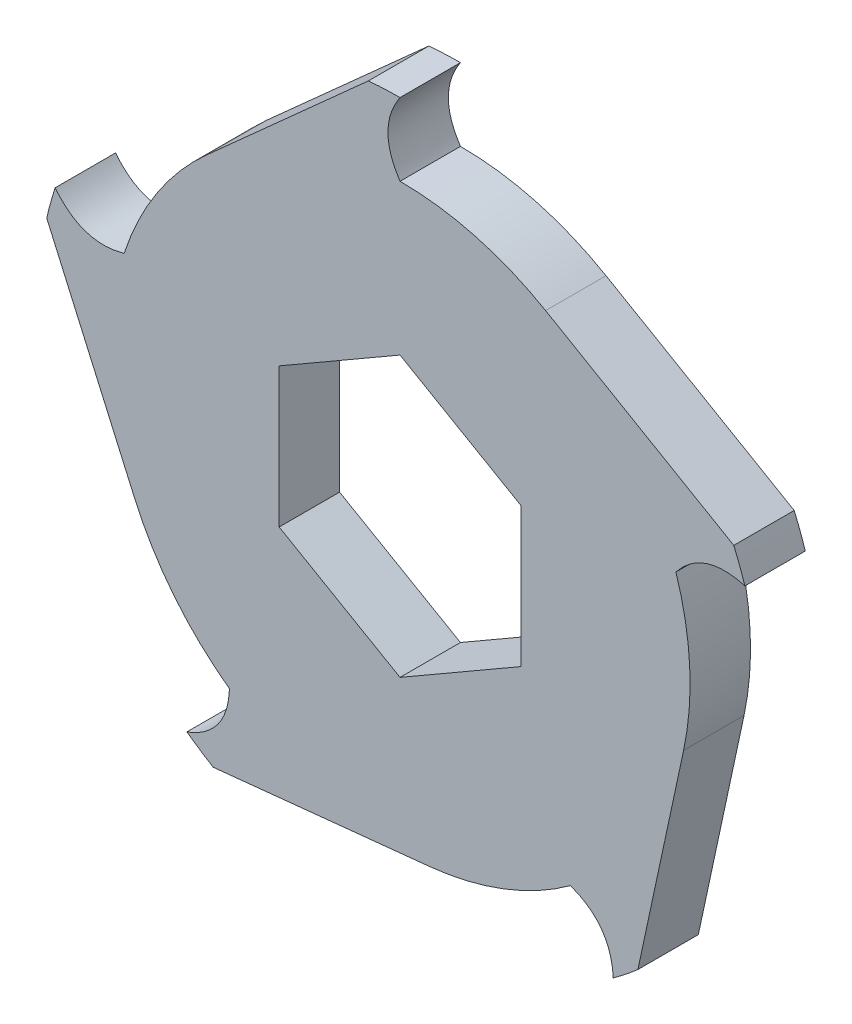
ISO-10303-21;
HEADER;
FILE_DESCRIPTION(('STEP AP214'),'2;1');
FILE_NAME('part.step','',(''),(''),'','','');
FILE_SCHEMA(('AUTOMOTIVE_DESIGN { 1 0 10303 214 1 1 1 1 }'));
ENDSEC;
DATA;
#1=APPLICATION_CONTEXT('core data for automotive mechanical design processes');
#2=APPLICATION_PROTOCOL_DEFINITION('international standard','automotive_design',2000,#1);
#3=PRODUCT_CONTEXT('',#1,'mechanical');
#4=PRODUCT('Part','Part','',(#3));
#5=PRODUCT_RELATED_PRODUCT_CATEGORY('part','',(#4));
#6=PRODUCT_DEFINITION_FORMATION('','',#4);
#7=PRODUCT_DEFINITION_CONTEXT('part definition',#1,'design');
#8=PRODUCT_DEFINITION('design','',#6,#7);
#9=PRODUCT_DEFINITION_SHAPE('','',#8);
#10=(LENGTH_UNIT() NAMED_UNIT(*) SI_UNIT(.MILLI.,.METRE.));
#11=(NAMED_UNIT(*) PLANE_ANGLE_UNIT() SI_UNIT($,.RADIAN.));
#12=(NAMED_UNIT(*) SI_UNIT($,.STERADIAN.) SOLID_ANGLE_UNIT());
#13=UNCERTAINTY_MEASURE_WITH_UNIT(LENGTH_MEASURE(1.E-05),#10,'distance_accuracy_value','');
#14=(GEOMETRIC_REPRESENTATION_CONTEXT(3) GLOBAL_UNCERTAINTY_ASSIGNED_CONTEXT((#13)) GLOBAL_UNIT_ASSIGNED_CONTEXT((#10,
#11,#12)) REPRESENTATION_CONTEXT('',''));
#15=CARTESIAN_POINT('',(0.,0.,0.));
#16=DIRECTION('',(0.,0.,1.));
#17=DIRECTION('',(1.,0.,0.));
#18=AXIS2_PLACEMENT_3D('',#15,#16,#17);
#19=CARTESIAN_POINT('',(0.,0.,6.35));
#20=DIRECTION('',(0.,0.,-1.));
#21=DIRECTION('',(-1.,0.,0.));
#22=AXIS2_PLACEMENT_3D('',#19,#20,#21);
#23=CYLINDRICAL_SURFACE('',#22,30.48);
#24=DIRECTION('',(0.,0.,-1.));
#25=VECTOR('',#24,1.);
#26=CARTESIAN_POINT('',(-28.9882026166763,9.41883798854832,6.35));
#27=LINE('',#26,#25);
#28=CARTESIAN_POINT('',(-28.9882026166763,9.41883798854831,6.35));
#29=VERTEX_POINT('',#28);
#30=CARTESIAN_POINT('',(-28.9882026166763,9.41883798854831,0.));
#31=VERTEX_POINT('',#30);
#32=EDGE_CURVE('E244',#29,#31,#27,.T.);
#33=ORIENTED_EDGE('',*,*,#32,.F.);
#34=CARTESIAN_POINT('',(0.,0.,6.35));
#35=DIRECTION('',(0.,0.,1.));
#36=DIRECTION('',(1.,0.,0.));
#37=AXIS2_PLACEMENT_3D('',#34,#35,#36);
#38=CIRCLE('',#37,30.48);
#39=CARTESIAN_POINT('',(-20.3436142698606,22.6973072949001,6.35));
#40=VERTEX_POINT('',#39);
#41=EDGE_CURVE('E230',#40,#29,#38,.T.);
#42=ORIENTED_EDGE('',*,*,#41,.F.);
#43=DIRECTION('',(0.,0.,-1.));
#44=VECTOR('',#43,1.);
#45=CARTESIAN_POINT('',(-20.3436142698606,22.6973072949001,6.35));
#46=LINE('',#45,#44);
#47=CARTESIAN_POINT('',(-20.3436142698606,22.6973072949001,0.));
#48=VERTEX_POINT('',#47);
#49=EDGE_CURVE('E419',#40,#48,#46,.T.);
#50=ORIENTED_EDGE('',*,*,#49,.T.);
#51=CARTESIAN_POINT('',(0.,0.,0.));
#52=DIRECTION('',(0.,0.,1.));
#53=DIRECTION('',(1.,0.,0.));
#54=AXIS2_PLACEMENT_3D('',#51,#52,#53);
#55=CIRCLE('',#54,30.48);
#56=EDGE_CURVE('E495',#48,#31,#55,.T.);
#57=ORIENTED_EDGE('',*,*,#56,.T.);
#58=EDGE_LOOP('',(#33,#42,#50,#57));
#59=FACE_BOUND('',#58,.T.);
#60=ADVANCED_FACE('F47',(#59),#23,.T.);
#61=CARTESIAN_POINT('',(-27.8729445415639,-12.3340732356715,6.35));
#62=VERTEX_POINT('',#61);
#63=CARTESIAN_POINT('',(-17.9156944898744,-24.6588379885485,6.35));
#64=VERTEX_POINT('',#63);
#65=EDGE_CURVE('E494',#62,#64,#38,.T.);
#66=ORIENTED_EDGE('',*,*,#65,.F.);
#67=DIRECTION('',(0.,0.,-1.));
#68=VECTOR('',#67,1.);
#69=CARTESIAN_POINT('',(-27.8729445415638,-12.3340732356715,6.35));
#70=LINE('',#69,#68);
#71=CARTESIAN_POINT('',(-27.8729445415638,-12.3340732356715,0.));
#72=VERTEX_POINT('',#71);
#73=EDGE_CURVE('E254',#62,#72,#70,.T.);
#74=ORIENTED_EDGE('',*,*,#73,.T.);
#75=CARTESIAN_POINT('',(-17.9156944898744,-24.6588379885485,0.));
#76=VERTEX_POINT('',#75);
#77=EDGE_CURVE('E498',#72,#76,#55,.T.);
#78=ORIENTED_EDGE('',*,*,#77,.T.);
#79=DIRECTION('',(0.,0.,-1.));
#80=VECTOR('',#79,1.);
#81=CARTESIAN_POINT('',(-17.9156944898744,-24.6588379885485,6.35));
#82=LINE('',#81,#80);
#83=EDGE_CURVE('E265',#64,#76,#82,.T.);
#84=ORIENTED_EDGE('',*,*,#83,.F.);
#85=EDGE_LOOP('',(#66,#74,#78,#84));
#86=FACE_BOUND('',#85,.T.);
#87=ADVANCED_FACE('F549',(#86),#23,.T.);
#88=CARTESIAN_POINT('',(3.11718717663342,-30.3201837742754,6.35));
#89=VERTEX_POINT('',#88);
#90=CARTESIAN_POINT('',(17.9156944898748,-24.6588379885482,6.35));
#91=VERTEX_POINT('',#90);
#92=EDGE_CURVE('E571',#89,#91,#38,.T.);
#93=ORIENTED_EDGE('',*,*,#92,.F.);
#94=DIRECTION('',(0.,0.,-1.));
#95=VECTOR('',#94,1.);
#96=CARTESIAN_POINT('',(3.11718717663344,-30.3201837742754,6.35));
#97=LINE('',#96,#95);
#98=CARTESIAN_POINT('',(3.11718717663344,-30.3201837742754,0.));
#99=VERTEX_POINT('',#98);
#100=EDGE_CURVE('E631',#89,#99,#97,.T.);
#101=ORIENTED_EDGE('',*,*,#100,.T.);
#102=CARTESIAN_POINT('',(17.9156944898748,-24.6588379885482,0.));
#103=VERTEX_POINT('',#102);
#104=EDGE_CURVE('E583',#99,#103,#55,.T.);
#105=ORIENTED_EDGE('',*,*,#104,.T.);
#106=DIRECTION('',(0.,0.,-1.));
#107=VECTOR('',#106,1.);
#108=CARTESIAN_POINT('',(17.9156944898748,-24.6588379885482,6.35));
#109=LINE('',#108,#107);
#110=EDGE_CURVE('E362',#91,#103,#109,.T.);
#111=ORIENTED_EDGE('',*,*,#110,.F.);
#112=EDGE_LOOP('',(#93,#101,#105,#111));
#113=FACE_BOUND('',#112,.T.);
#114=ADVANCED_FACE('F554',(#113),#23,.T.);
#115=CARTESIAN_POINT('',(29.7994721660186,-6.40483088197364,6.35));
#116=VERTEX_POINT('',#115);
#117=CARTESIAN_POINT('',(28.9882026166762,9.41883798854872,6.35));
#118=VERTEX_POINT('',#117);
#119=EDGE_CURVE('E567',#116,#118,#38,.T.);
#120=ORIENTED_EDGE('',*,*,#119,.F.);
#121=DIRECTION('',(0.,0.,-1.));
#122=VECTOR('',#121,1.);
#123=CARTESIAN_POINT('',(29.7994721660186,-6.40483088197361,6.35));
#124=LINE('',#123,#122);
#125=CARTESIAN_POINT('',(29.7994721660186,-6.40483088197361,0.));
#126=VERTEX_POINT('',#125);
#127=EDGE_CURVE('E336',#116,#126,#124,.T.);
#128=ORIENTED_EDGE('',*,*,#127,.T.);
#129=CARTESIAN_POINT('',(28.9882026166762,9.41883798854872,0.));
#130=VERTEX_POINT('',#129);
#131=EDGE_CURVE('E579',#126,#130,#55,.T.);
#132=ORIENTED_EDGE('',*,*,#131,.T.);
#133=DIRECTION('',(0.,0.,-1.));
#134=VECTOR('',#133,1.);
#135=CARTESIAN_POINT('',(28.9882026166762,9.41883798854872,6.35));
#136=LINE('',#135,#134);
#137=EDGE_CURVE('E71',#118,#130,#136,.T.);
#138=ORIENTED_EDGE('',*,*,#137,.F.);
#139=EDGE_LOOP('',(#120,#128,#132,#138));
#140=FACE_BOUND('',#139,.T.);
#141=ADVANCED_FACE('F557',(#140),#23,.T.);
#142=CARTESIAN_POINT('',(15.2998994687724,26.3617805970208,6.35));
#143=VERTEX_POINT('',#142);
#144=CARTESIAN_POINT('',(0.,30.48,6.35));
#145=VERTEX_POINT('',#144);
#146=EDGE_CURVE('E63',#143,#145,#38,.T.);
#147=ORIENTED_EDGE('',*,*,#146,.F.);
#148=DIRECTION('',(0.,0.,-1.));
#149=VECTOR('',#148,1.);
#150=CARTESIAN_POINT('',(15.2998994687723,26.3617805970208,6.35));
#151=LINE('',#150,#149);
#152=CARTESIAN_POINT('',(15.2998994687723,26.3617805970208,0.));
#153=VERTEX_POINT('',#152);
#154=EDGE_CURVE('E588',#143,#153,#151,.T.);
#155=ORIENTED_EDGE('',*,*,#154,.T.);
#156=CARTESIAN_POINT('',(0.,30.48,0.));
#157=VERTEX_POINT('',#156);
#158=EDGE_CURVE('E475',#153,#157,#55,.T.);
#159=ORIENTED_EDGE('',*,*,#158,.T.);
#160=DIRECTION('',(0.,0.,-1.));
#161=VECTOR('',#160,1.);
#162=CARTESIAN_POINT('',(0.,30.48,6.35));
#163=LINE('',#162,#161);
#164=EDGE_CURVE('E444',#145,#157,#163,.T.);
#165=ORIENTED_EDGE('',*,*,#164,.F.);
#166=EDGE_LOOP('',(#147,#155,#159,#165));
#167=FACE_BOUND('',#166,.T.);
#168=ADVANCED_FACE('F49',(#167),#23,.T.);
#169=CARTESIAN_POINT('',(0.,0.,6.35));
#170=DIRECTION('',(0.,0.,1.));
#171=DIRECTION('',(1.,0.,0.));
#172=AXIS2_PLACEMENT_3D('',#169,#170,#171);
#173=PLANE('',#172);
#174=DIRECTION('',(-0.866025403784439,0.5,0.));
#175=VECTOR('',#174,1.);
#176=CARTESIAN_POINT('',(12.7,7.33234841870825,6.35));
#177=LINE('',#176,#175);
#178=CARTESIAN_POINT('',(12.7,7.33234841870825,6.35));
#179=VERTEX_POINT('',#178);
#180=CARTESIAN_POINT('',(0.,14.6646968374165,6.35));
#181=VERTEX_POINT('',#180);
#182=EDGE_CURVE('E448',#179,#181,#177,.T.);
#183=ORIENTED_EDGE('',*,*,#182,.F.);
#184=DIRECTION('',(0.,1.,0.));
#185=VECTOR('',#184,1.);
#186=CARTESIAN_POINT('',(12.7,-7.33234841870825,6.35));
#187=LINE('',#186,#185);
#188=CARTESIAN_POINT('',(12.7,-7.33234841870825,6.35));
#189=VERTEX_POINT('',#188);
#190=EDGE_CURVE('E467',#189,#179,#187,.T.);
#191=ORIENTED_EDGE('',*,*,#190,.F.);
#192=DIRECTION('',(0.866025403784439,0.5,0.));
#193=VECTOR('',#192,1.);
#194=CARTESIAN_POINT('',(0.,-14.6646968374165,6.35));
#195=LINE('',#194,#193);
#196=CARTESIAN_POINT('',(0.,-14.6646968374165,6.35));
#197=VERTEX_POINT('',#196);
#198=EDGE_CURVE('E463',#197,#189,#195,.T.);
#199=ORIENTED_EDGE('',*,*,#198,.F.);
#200=DIRECTION('',(0.866025403784439,-0.5,0.));
#201=VECTOR('',#200,1.);
#202=CARTESIAN_POINT('',(-12.7,-7.33234841870825,6.35));
#203=LINE('',#202,#201);
#204=CARTESIAN_POINT('',(-12.7,-7.33234841870825,6.35));
#205=VERTEX_POINT('',#204);
#206=EDGE_CURVE('E459',#205,#197,#203,.T.);
#207=ORIENTED_EDGE('',*,*,#206,.F.);
#208=DIRECTION('',(0.,-1.,0.));
#209=VECTOR('',#208,1.);
#210=CARTESIAN_POINT('',(-12.7,7.33234841870825,6.35));
#211=LINE('',#210,#209);
#212=CARTESIAN_POINT('',(-12.7,7.33234841870825,6.35));
#213=VERTEX_POINT('',#212);
#214=EDGE_CURVE('E455',#213,#205,#211,.T.);
#215=ORIENTED_EDGE('',*,*,#214,.F.);
#216=DIRECTION('',(-0.866025403784439,-0.5,0.));
#217=VECTOR('',#216,1.);
#218=CARTESIAN_POINT('',(0.,14.6646968374165,6.35));
#219=LINE('',#218,#217);
#220=EDGE_CURVE('E451',#181,#213,#219,.T.);
#221=ORIENTED_EDGE('',*,*,#220,.F.);
#222=EDGE_LOOP('',(#183,#191,#199,#207,#215,#221));
#223=FACE_BOUND('',#222,.T.);
#224=ORIENTED_EDGE('',*,*,#41,.T.);
#225=CARTESIAN_POINT('',(-28.9882026166763,9.41883798854832,6.35));
#226=CARTESIAN_POINT('',(-33.3966311094732,8.18050918572716,6.35));
#227=CARTESIAN_POINT('',(-36.2352532708454,11.7735474856854,6.35));
#228=B_SPLINE_CURVE_WITH_KNOTS('',2,(#225,#226,#227),.UNSPECIFIED.,.F.,.F.,(3,3),(0.,1.),.UNSPECIFIED.);
#229=CARTESIAN_POINT('',(-36.2352532708454,11.7735474856854,6.35));
#230=VERTEX_POINT('',#229);
#231=EDGE_CURVE('E222',#29,#230,#228,.T.);
#232=ORIENTED_EDGE('',*,*,#231,.T.);
#233=CARTESIAN_POINT('',(0.,0.,6.35));
#234=DIRECTION('',(0.,0.,1.));
#235=DIRECTION('',(0.309016994374945,0.951056516295155,0.));
#236=AXIS2_PLACEMENT_3D('',#233,#234,#235);
#237=CIRCLE('',#236,38.1);
#238=CARTESIAN_POINT('',(-37.1234994683174,8.5706351705014,6.35));
#239=VERTEX_POINT('',#238);
#240=EDGE_CURVE('E227',#230,#239,#237,.T.);
#241=ORIENTED_EDGE('',*,*,#240,.T.);
#242=DIRECTION('',(0.404661195396045,-0.914466684434509,0.));
#243=VECTOR('',#242,1.);
#244=CARTESIAN_POINT('',(-27.8729445415639,-12.3340732356715,6.35));
#245=LINE('',#244,#243);
#246=EDGE_CURVE('E251',#239,#62,#245,.T.);
#247=ORIENTED_EDGE('',*,*,#246,.T.);
#248=ORIENTED_EDGE('',*,*,#65,.T.);
#249=CARTESIAN_POINT('',(-17.9156944898744,-24.6588379885485,6.35));
#250=CARTESIAN_POINT('',(-18.1002531353964,-29.2341672779399,6.35));
#251=CARTESIAN_POINT('',(-22.394618112343,-30.8235474856856,6.35));
#252=B_SPLINE_CURVE_WITH_KNOTS('',2,(#249,#250,#251),.UNSPECIFIED.,.F.,.F.,(3,3),(0.,1.),.UNSPECIFIED.);
#253=CARTESIAN_POINT('',(-22.3946181123431,-30.8235474856856,6.35));
#254=VERTEX_POINT('',#253);
#255=EDGE_CURVE('E282',#64,#254,#252,.T.);
#256=ORIENTED_EDGE('',*,*,#255,.T.);
#257=CARTESIAN_POINT('',(0.,0.,6.35));
#258=DIRECTION('',(0.,0.,1.));
#259=DIRECTION('',(-0.809016994374951,0.587785252292469,0.));
#260=AXIS2_PLACEMENT_3D('',#257,#258,#259);
#261=CIRCLE('',#260,38.1);
#262=CARTESIAN_POINT('',(-19.6229506540731,-32.6580741567504,6.35));
#263=VERTEX_POINT('',#262);
#264=EDGE_CURVE('E288',#254,#263,#261,.T.);
#265=ORIENTED_EDGE('',*,*,#264,.T.);
#266=DIRECTION('',(0.994756685507723,0.102269920493222,0.));
#267=VECTOR('',#266,1.);
#268=CARTESIAN_POINT('',(3.11718717663342,-30.3201837742754,6.35));
#269=LINE('',#268,#267);
#270=EDGE_CURVE('E623',#263,#89,#269,.T.);
#271=ORIENTED_EDGE('',*,*,#270,.T.);
#272=ORIENTED_EDGE('',*,*,#92,.T.);
#273=CARTESIAN_POINT('',(17.9156944898748,-24.6588379885482,6.35));
#274=CARTESIAN_POINT('',(22.2100594668215,-26.2482181962939,6.35));
#275=CARTESIAN_POINT('',(22.3946181123435,-30.8235474856853,6.35));
#276=B_SPLINE_CURVE_WITH_KNOTS('',2,(#273,#274,#275),.UNSPECIFIED.,.F.,.F.,(3,3),(0.,1.),.UNSPECIFIED.);
#277=CARTESIAN_POINT('',(22.3946181123435,-30.8235474856853,6.35));
#278=VERTEX_POINT('',#277);
#279=EDGE_CURVE('E317',#91,#278,#276,.T.);
#280=ORIENTED_EDGE('',*,*,#279,.T.);
#281=CARTESIAN_POINT('',(0.,0.,6.35));
#282=DIRECTION('',(0.,0.,1.));
#283=DIRECTION('',(-0.809016994374942,-0.58778525229248,0.));
#284=AXIS2_PLACEMENT_3D('',#281,#282,#283);
#285=CIRCLE('',#284,38.1);
#286=CARTESIAN_POINT('',(24.9958490045384,-28.7544350064876,6.35));
#287=VERTEX_POINT('',#286);
#288=EDGE_CURVE('E324',#278,#287,#285,.T.);
#289=ORIENTED_EDGE('',*,*,#288,.T.);
#290=DIRECTION('',(0.210132246783912,0.977672971326069,0.));
#291=VECTOR('',#290,1.);
#292=CARTESIAN_POINT('',(29.7994721660186,-6.40483088197363,6.35));
#293=LINE('',#292,#291);
#294=EDGE_CURVE('E332',#287,#116,#293,.T.);
#295=ORIENTED_EDGE('',*,*,#294,.T.);
#296=ORIENTED_EDGE('',*,*,#119,.T.);
#297=CARTESIAN_POINT('',(28.9882026166762,9.41883798854873,6.35));
#298=CARTESIAN_POINT('',(31.8268247780483,13.011876288507,6.35));
#299=CARTESIAN_POINT('',(36.2352532708452,11.7735474856859,6.35));
#300=B_SPLINE_CURVE_WITH_KNOTS('',2,(#297,#298,#299),.UNSPECIFIED.,.F.,.F.,(3,3),(0.,1.),.UNSPECIFIED.);
#301=CARTESIAN_POINT('',(36.2352532708452,11.7735474856859,6.35));
#302=VERTEX_POINT('',#301);
#303=EDGE_CURVE('E367',#118,#302,#300,.T.);
#304=ORIENTED_EDGE('',*,*,#303,.T.);
#305=CARTESIAN_POINT('',(0.,0.,6.35));
#306=DIRECTION('',(0.,0.,1.));
#307=DIRECTION('',(0.309016994374958,-0.95105651629515,0.));
#308=AXIS2_PLACEMENT_3D('',#305,#306,#307);
#309=CIRCLE('',#308,38.1);
#310=CARTESIAN_POINT('',(35.0712349165379,14.8868559954415,6.35));
#311=VERTEX_POINT('',#310);
#312=EDGE_CURVE('E373',#302,#311,#309,.T.);
#313=ORIENTED_EDGE('',*,*,#312,.T.);
#314=DIRECTION('',(-0.864887814862885,0.501965205668385,0.));
#315=VECTOR('',#314,1.);
#316=CARTESIAN_POINT('',(15.2998994687724,26.3617805970207,6.35));
#317=LINE('',#316,#315);
#318=EDGE_CURVE('E600',#311,#143,#317,.T.);
#319=ORIENTED_EDGE('',*,*,#318,.T.);
#320=ORIENTED_EDGE('',*,*,#146,.T.);
#321=CARTESIAN_POINT('',(0.,30.48,6.35));
#322=CARTESIAN_POINT('',(-2.54,34.29,6.35));
#323=CARTESIAN_POINT('',(0.,38.1,6.35));
#324=B_SPLINE_CURVE_WITH_KNOTS('',2,(#321,#322,#323),.UNSPECIFIED.,.F.,.F.,(3,3),(0.,1.),.UNSPECIFIED.);
#325=CARTESIAN_POINT('',(0.,38.1,6.35));
#326=VERTEX_POINT('',#325);
#327=EDGE_CURVE('E401',#145,#326,#324,.T.);
#328=ORIENTED_EDGE('',*,*,#327,.T.);
#329=CARTESIAN_POINT('',(0.,0.,6.35));
#330=DIRECTION('',(0.,0.,1.));
#331=DIRECTION('',(1.,0.,0.));
#332=AXIS2_PLACEMENT_3D('',#329,#330,#331);
#333=CIRCLE('',#332,38.1);
#334=CARTESIAN_POINT('',(-3.32063379868552,37.9550179972955,6.35));
#335=VERTEX_POINT('',#334);
#336=EDGE_CURVE('E408',#326,#335,#333,.T.);
#337=ORIENTED_EDGE('',*,*,#336,.T.);
#338=DIRECTION('',(-0.744662312824807,-0.667441413053168,0.));
#339=VECTOR('',#338,1.);
#340=CARTESIAN_POINT('',(-20.3436142698606,22.6973072949001,6.35));
#341=LINE('',#340,#339);
#342=EDGE_CURVE('E416',#335,#40,#341,.T.);
#343=ORIENTED_EDGE('',*,*,#342,.T.);
#344=EDGE_LOOP('',(#224,#232,#241,#247,#248,#256,#265,#271,#272,#280,#289,#295,#296,#304,#313,
#319,#320,#328,#337,#343));
#345=FACE_BOUND('',#344,.T.);
#346=ADVANCED_FACE('F224',(#223,#345),#173,.T.);
#347=CARTESIAN_POINT('',(0.,0.,0.));
#348=DIRECTION('',(0.,0.,1.));
#349=DIRECTION('',(1.,0.,0.));
#350=AXIS2_PLACEMENT_3D('',#347,#348,#349);
#351=PLANE('',#350);
#352=DIRECTION('',(0.,1.,0.));
#353=VECTOR('',#352,1.);
#354=CARTESIAN_POINT('',(12.7,0.,0.));
#355=LINE('',#354,#353);
#356=CARTESIAN_POINT('',(12.7,-7.33234841870825,0.));
#357=VERTEX_POINT('',#356);
#358=CARTESIAN_POINT('',(12.7,7.33234841870825,0.));
#359=VERTEX_POINT('',#358);
#360=EDGE_CURVE('E56',#357,#359,#355,.T.);
#361=ORIENTED_EDGE('',*,*,#360,.T.);
#362=DIRECTION('',(-0.866025403784439,0.5,0.));
#363=VECTOR('',#362,1.);
#364=CARTESIAN_POINT('',(6.35,10.9985226280624,0.));
#365=LINE('',#364,#363);
#366=CARTESIAN_POINT('',(0.,14.6646968374165,0.));
#367=VERTEX_POINT('',#366);
#368=EDGE_CURVE('E11',#359,#367,#365,.T.);
#369=ORIENTED_EDGE('',*,*,#368,.T.);
#370=DIRECTION('',(-0.866025403784439,-0.5,0.));
#371=VECTOR('',#370,1.);
#372=CARTESIAN_POINT('',(-6.35,10.9985226280624,0.));
#373=LINE('',#372,#371);
#374=CARTESIAN_POINT('',(-12.7,7.33234841870825,0.));
#375=VERTEX_POINT('',#374);
#376=EDGE_CURVE('E493',#367,#375,#373,.T.);
#377=ORIENTED_EDGE('',*,*,#376,.T.);
#378=DIRECTION('',(0.,-1.,0.));
#379=VECTOR('',#378,1.);
#380=CARTESIAN_POINT('',(-12.7,0.,0.));
#381=LINE('',#380,#379);
#382=CARTESIAN_POINT('',(-12.7,-7.33234841870825,0.));
#383=VERTEX_POINT('',#382);
#384=EDGE_CURVE('E502',#375,#383,#381,.T.);
#385=ORIENTED_EDGE('',*,*,#384,.T.);
#386=DIRECTION('',(0.866025403784439,-0.5,0.));
#387=VECTOR('',#386,1.);
#388=CARTESIAN_POINT('',(-6.35,-10.9985226280624,0.));
#389=LINE('',#388,#387);
#390=CARTESIAN_POINT('',(0.,-14.6646968374165,0.));
#391=VERTEX_POINT('',#390);
#392=EDGE_CURVE('E506',#383,#391,#389,.T.);
#393=ORIENTED_EDGE('',*,*,#392,.T.);
#394=DIRECTION('',(0.866025403784439,0.5,0.));
#395=VECTOR('',#394,1.);
#396=CARTESIAN_POINT('',(6.35,-10.9985226280624,0.));
#397=LINE('',#396,#395);
#398=EDGE_CURVE('E510',#391,#357,#397,.T.);
#399=ORIENTED_EDGE('',*,*,#398,.T.);
#400=EDGE_LOOP('',(#361,#369,#377,#385,#393,#399));
#401=FACE_BOUND('',#400,.T.);
#402=ORIENTED_EDGE('',*,*,#56,.F.);
#403=DIRECTION('',(-0.744662312824807,-0.667441413053168,0.));
#404=VECTOR('',#403,1.);
#405=CARTESIAN_POINT('',(-20.3436142698606,22.6973072949001,0.));
#406=LINE('',#405,#404);
#407=CARTESIAN_POINT('',(-3.32063379868552,37.9550179972955,0.));
#408=VERTEX_POINT('',#407);
#409=EDGE_CURVE('E409',#408,#48,#406,.T.);
#410=ORIENTED_EDGE('',*,*,#409,.F.);
#411=CARTESIAN_POINT('',(0.,0.,0.));
#412=DIRECTION('',(0.,0.,1.));
#413=DIRECTION('',(1.,0.,0.));
#414=AXIS2_PLACEMENT_3D('',#411,#412,#413);
#415=CIRCLE('',#414,38.1);
#416=CARTESIAN_POINT('',(0.,38.1,0.));
#417=VERTEX_POINT('',#416);
#418=EDGE_CURVE('E424',#417,#408,#415,.T.);
#419=ORIENTED_EDGE('',*,*,#418,.F.);
#420=CARTESIAN_POINT('',(0.,30.48,0.));
#421=CARTESIAN_POINT('',(-2.54,34.29,0.));
#422=CARTESIAN_POINT('',(0.,38.1,0.));
#423=B_SPLINE_CURVE_WITH_KNOTS('',2,(#420,#421,#422),.UNSPECIFIED.,.F.,.F.,(3,3),(0.,1.),.UNSPECIFIED.);
#424=EDGE_CURVE('E281',#157,#417,#423,.T.);
#425=ORIENTED_EDGE('',*,*,#424,.F.);
#426=ORIENTED_EDGE('',*,*,#158,.F.);
#427=DIRECTION('',(-0.864887814862885,0.501965205668385,0.));
#428=VECTOR('',#427,1.);
#429=CARTESIAN_POINT('',(15.2998994687724,26.3617805970207,0.));
#430=LINE('',#429,#428);
#431=CARTESIAN_POINT('',(35.0712349165379,14.8868559954415,0.));
#432=VERTEX_POINT('',#431);
#433=EDGE_CURVE('E374',#432,#153,#430,.T.);
#434=ORIENTED_EDGE('',*,*,#433,.F.);
#435=CARTESIAN_POINT('',(0.,0.,0.));
#436=DIRECTION('',(0.,0.,1.));
#437=DIRECTION('',(0.309016994374958,-0.95105651629515,0.));
#438=AXIS2_PLACEMENT_3D('',#435,#436,#437);
#439=CIRCLE('',#438,38.1);
#440=CARTESIAN_POINT('',(36.2352532708452,11.7735474856859,0.));
#441=VERTEX_POINT('',#440);
#442=EDGE_CURVE('E879',#441,#432,#439,.T.);
#443=ORIENTED_EDGE('',*,*,#442,.F.);
#444=CARTESIAN_POINT('',(28.9882026166762,9.41883798854873,0.));
#445=CARTESIAN_POINT('',(31.8268247780483,13.011876288507,0.));
#446=CARTESIAN_POINT('',(36.2352532708452,11.7735474856859,0.));
#447=B_SPLINE_CURVE_WITH_KNOTS('',2,(#444,#445,#446),.UNSPECIFIED.,.F.,.F.,(3,3),(0.,1.),.UNSPECIFIED.);
#448=EDGE_CURVE('E581',#130,#441,#447,.T.);
#449=ORIENTED_EDGE('',*,*,#448,.F.);
#450=ORIENTED_EDGE('',*,*,#131,.F.);
#451=DIRECTION('',(0.210132246783912,0.977672971326069,0.));
#452=VECTOR('',#451,1.);
#453=CARTESIAN_POINT('',(29.7994721660186,-6.40483088197363,0.));
#454=LINE('',#453,#452);
#455=CARTESIAN_POINT('',(24.9958490045384,-28.7544350064876,0.));
#456=VERTEX_POINT('',#455);
#457=EDGE_CURVE('E325',#456,#126,#454,.T.);
#458=ORIENTED_EDGE('',*,*,#457,.F.);
#459=CARTESIAN_POINT('',(0.,0.,0.));
#460=DIRECTION('',(0.,0.,1.));
#461=DIRECTION('',(-0.809016994374942,-0.58778525229248,0.));
#462=AXIS2_PLACEMENT_3D('',#459,#460,#461);
#463=CIRCLE('',#462,38.1);
#464=CARTESIAN_POINT('',(22.3946181123435,-30.8235474856853,0.));
#465=VERTEX_POINT('',#464);
#466=EDGE_CURVE('E342',#465,#456,#463,.T.);
#467=ORIENTED_EDGE('',*,*,#466,.F.);
#468=CARTESIAN_POINT('',(17.9156944898748,-24.6588379885482,0.));
#469=CARTESIAN_POINT('',(22.2100594668215,-26.2482181962939,0.));
#470=CARTESIAN_POINT('',(22.3946181123435,-30.8235474856853,0.));
#471=B_SPLINE_CURVE_WITH_KNOTS('',2,(#468,#469,#470),.UNSPECIFIED.,.F.,.F.,(3,3),(0.,1.),.UNSPECIFIED.);
#472=EDGE_CURVE('E337',#103,#465,#471,.T.);
#473=ORIENTED_EDGE('',*,*,#472,.F.);
#474=ORIENTED_EDGE('',*,*,#104,.F.);
#475=DIRECTION('',(0.994756685507723,0.102269920493222,0.));
#476=VECTOR('',#475,1.);
#477=CARTESIAN_POINT('',(3.11718717663342,-30.3201837742754,0.));
#478=LINE('',#477,#476);
#479=CARTESIAN_POINT('',(-19.6229506540731,-32.6580741567504,0.));
#480=VERTEX_POINT('',#479);
#481=EDGE_CURVE('E289',#480,#99,#478,.T.);
#482=ORIENTED_EDGE('',*,*,#481,.F.);
#483=CARTESIAN_POINT('',(0.,0.,0.));
#484=DIRECTION('',(0.,0.,1.));
#485=DIRECTION('',(-0.809016994374951,0.587785252292469,0.));
#486=AXIS2_PLACEMENT_3D('',#483,#484,#485);
#487=CIRCLE('',#486,38.1);
#488=CARTESIAN_POINT('',(-22.3946181123431,-30.8235474856856,0.));
#489=VERTEX_POINT('',#488);
#490=EDGE_CURVE('E616',#489,#480,#487,.T.);
#491=ORIENTED_EDGE('',*,*,#490,.F.);
#492=CARTESIAN_POINT('',(-17.9156944898744,-24.6588379885485,0.));
#493=CARTESIAN_POINT('',(-18.1002531353964,-29.2341672779399,0.));
#494=CARTESIAN_POINT('',(-22.394618112343,-30.8235474856856,0.));
#495=B_SPLINE_CURVE_WITH_KNOTS('',2,(#492,#493,#494),.UNSPECIFIED.,.F.,.F.,(3,3),(0.,1.),.UNSPECIFIED.);
#496=EDGE_CURVE('E366',#76,#489,#495,.T.);
#497=ORIENTED_EDGE('',*,*,#496,.F.);
#498=ORIENTED_EDGE('',*,*,#77,.F.);
#499=DIRECTION('',(0.404661195396045,-0.914466684434509,0.));
#500=VECTOR('',#499,1.);
#501=CARTESIAN_POINT('',(-27.8729445415639,-12.3340732356715,0.));
#502=LINE('',#501,#500);
#503=CARTESIAN_POINT('',(-37.1234994683174,8.5706351705014,0.));
#504=VERTEX_POINT('',#503);
#505=EDGE_CURVE('E234',#504,#72,#502,.T.);
#506=ORIENTED_EDGE('',*,*,#505,.F.);
#507=CARTESIAN_POINT('',(0.,0.,0.));
#508=DIRECTION('',(0.,0.,1.));
#509=DIRECTION('',(0.309016994374945,0.951056516295155,0.));
#510=AXIS2_PLACEMENT_3D('',#507,#508,#509);
#511=CIRCLE('',#510,38.1);
#512=CARTESIAN_POINT('',(-36.2352532708454,11.7735474856854,0.));
#513=VERTEX_POINT('',#512);
#514=EDGE_CURVE('E264',#513,#504,#511,.T.);
#515=ORIENTED_EDGE('',*,*,#514,.F.);
#516=CARTESIAN_POINT('',(-28.9882026166763,9.41883798854832,0.));
#517=CARTESIAN_POINT('',(-33.3966311094732,8.18050918572716,0.));
#518=CARTESIAN_POINT('',(-36.2352532708454,11.7735474856854,0.));
#519=B_SPLINE_CURVE_WITH_KNOTS('',2,(#516,#517,#518),.UNSPECIFIED.,.F.,.F.,(3,3),(0.,1.),.UNSPECIFIED.);
#520=EDGE_CURVE('E240',#31,#513,#519,.T.);
#521=ORIENTED_EDGE('',*,*,#520,.F.);
#522=EDGE_LOOP('',(#402,#410,#419,#425,#426,#434,#443,#449,#450,#458,#467,#473,#474,#482,#491,
#497,#498,#506,#515,#521));
#523=FACE_BOUND('',#522,.T.);
#524=ADVANCED_FACE('F516',(#401,#523),#351,.F.);
#525=CARTESIAN_POINT('',(12.7,7.33234841870825,-1.2E-05));
#526=DIRECTION('',(0.5,0.866025403784439,0.));
#527=DIRECTION('',(-0.866025403784439,0.5,0.));
#528=AXIS2_PLACEMENT_3D('',#525,#526,#527);
#529=PLANE('',#528);
#530=DIRECTION('',(0.,0.,1.));
#531=VECTOR('',#530,1.);
#532=CARTESIAN_POINT('',(12.7,7.33234841870825,-1.2E-05));
#533=LINE('',#532,#531);
#534=EDGE_CURVE('E472',#359,#179,#533,.T.);
#535=ORIENTED_EDGE('',*,*,#534,.T.);
#536=ORIENTED_EDGE('',*,*,#182,.T.);
#537=DIRECTION('',(0.,0.,1.));
#538=VECTOR('',#537,1.);
#539=CARTESIAN_POINT('',(0.,14.6646968374165,-1.2E-05));
#540=LINE('',#539,#538);
#541=EDGE_CURVE('E471',#367,#181,#540,.T.);
#542=ORIENTED_EDGE('',*,*,#541,.F.);
#543=ORIENTED_EDGE('',*,*,#368,.F.);
#544=EDGE_LOOP('',(#535,#536,#542,#543));
#545=FACE_BOUND('',#544,.T.);
#546=ADVANCED_FACE('F533',(#545),#529,.F.);
#547=CARTESIAN_POINT('',(12.7,-7.33234841870825,-1.2E-05));
#548=DIRECTION('',(1.,0.,0.));
#549=DIRECTION('',(0.,0.,-1.));
#550=AXIS2_PLACEMENT_3D('',#547,#548,#549);
#551=PLANE('',#550);
#552=DIRECTION('',(0.,0.,1.));
#553=VECTOR('',#552,1.);
#554=CARTESIAN_POINT('',(12.7,-7.33234841870825,-1.2E-05));
#555=LINE('',#554,#553);
#556=EDGE_CURVE('E476',#357,#189,#555,.T.);
#557=ORIENTED_EDGE('',*,*,#556,.T.);
#558=ORIENTED_EDGE('',*,*,#190,.T.);
#559=ORIENTED_EDGE('',*,*,#534,.F.);
#560=ORIENTED_EDGE('',*,*,#360,.F.);
#561=EDGE_LOOP('',(#557,#558,#559,#560));
#562=FACE_BOUND('',#561,.T.);
#563=ADVANCED_FACE('F399',(#562),#551,.F.);
#564=CARTESIAN_POINT('',(0.,-14.6646968374165,-1.2E-05));
#565=DIRECTION('',(0.5,-0.866025403784439,0.));
#566=DIRECTION('',(0.866025403784439,0.5,0.));
#567=AXIS2_PLACEMENT_3D('',#564,#565,#566);
#568=PLANE('',#567);
#569=DIRECTION('',(0.,0.,1.));
#570=VECTOR('',#569,1.);
#571=CARTESIAN_POINT('',(0.,-14.6646968374165,-1.2E-05));
#572=LINE('',#571,#570);
#573=EDGE_CURVE('E479',#391,#197,#572,.T.);
#574=ORIENTED_EDGE('',*,*,#573,.T.);
#575=ORIENTED_EDGE('',*,*,#198,.T.);
#576=ORIENTED_EDGE('',*,*,#556,.F.);
#577=ORIENTED_EDGE('',*,*,#398,.F.);
#578=EDGE_LOOP('',(#574,#575,#576,#577));
#579=FACE_BOUND('',#578,.T.);
#580=ADVANCED_FACE('F522',(#579),#568,.F.);
#581=CARTESIAN_POINT('',(-12.7,-7.33234841870825,-1.2E-05));
#582=DIRECTION('',(-0.5,-0.866025403784439,0.));
#583=DIRECTION('',(0.866025403784439,-0.5,0.));
#584=AXIS2_PLACEMENT_3D('',#581,#582,#583);
#585=PLANE('',#584);
#586=DIRECTION('',(0.,0.,1.));
#587=VECTOR('',#586,1.);
#588=CARTESIAN_POINT('',(-12.7,-7.33234841870825,-1.2E-05));
#589=LINE('',#588,#587);
#590=EDGE_CURVE('E482',#383,#205,#589,.T.);
#591=ORIENTED_EDGE('',*,*,#590,.T.);
#592=ORIENTED_EDGE('',*,*,#206,.T.);
#593=ORIENTED_EDGE('',*,*,#573,.F.);
#594=ORIENTED_EDGE('',*,*,#392,.F.);
#595=EDGE_LOOP('',(#591,#592,#593,#594));
#596=FACE_BOUND('',#595,.T.);
#597=ADVANCED_FACE('F540',(#596),#585,.F.);
#598=CARTESIAN_POINT('',(-12.7,7.33234841870825,-1.2E-05));
#599=DIRECTION('',(-1.,0.,0.));
#600=DIRECTION('',(0.,-1.,0.));
#601=AXIS2_PLACEMENT_3D('',#598,#599,#600);
#602=PLANE('',#601);
#603=DIRECTION('',(0.,0.,1.));
#604=VECTOR('',#603,1.);
#605=CARTESIAN_POINT('',(-12.7,7.33234841870825,-1.2E-05));
#606=LINE('',#605,#604);
#607=EDGE_CURVE('E485',#375,#213,#606,.T.);
#608=ORIENTED_EDGE('',*,*,#607,.T.);
#609=ORIENTED_EDGE('',*,*,#214,.T.);
#610=ORIENTED_EDGE('',*,*,#590,.F.);
#611=ORIENTED_EDGE('',*,*,#384,.F.);
#612=EDGE_LOOP('',(#608,#609,#610,#611));
#613=FACE_BOUND('',#612,.T.);
#614=ADVANCED_FACE('F538',(#613),#602,.F.);
#615=CARTESIAN_POINT('',(0.,14.6646968374165,-1.2E-05));
#616=DIRECTION('',(-0.5,0.866025403784439,0.));
#617=DIRECTION('',(-0.866025403784439,-0.5,0.));
#618=AXIS2_PLACEMENT_3D('',#615,#616,#617);
#619=PLANE('',#618);
#620=ORIENTED_EDGE('',*,*,#541,.T.);
#621=ORIENTED_EDGE('',*,*,#220,.T.);
#622=ORIENTED_EDGE('',*,*,#607,.F.);
#623=ORIENTED_EDGE('',*,*,#376,.F.);
#624=EDGE_LOOP('',(#620,#621,#622,#623));
#625=FACE_BOUND('',#624,.T.);
#626=ADVANCED_FACE('F397',(#625),#619,.F.);
#627=DIRECTION('',(0.,0.,-1.));
#628=VECTOR('',#627,1.);
#629=SURFACE_OF_LINEAR_EXTRUSION('',#324,#628);
#630=ORIENTED_EDGE('',*,*,#424,.T.);
#631=DIRECTION('',(0.,0.,-1.));
#632=VECTOR('',#631,1.);
#633=CARTESIAN_POINT('',(0.,38.1,6.35));
#634=LINE('',#633,#632);
#635=EDGE_CURVE('E440',#326,#417,#634,.T.);
#636=ORIENTED_EDGE('',*,*,#635,.F.);
#637=ORIENTED_EDGE('',*,*,#327,.F.);
#638=ORIENTED_EDGE('',*,*,#164,.T.);
#639=EDGE_LOOP('',(#630,#636,#637,#638));
#640=FACE_BOUND('',#639,.T.);
#641=ADVANCED_FACE('F392',(#640),#629,.F.);
#642=CARTESIAN_POINT('',(0.,0.,6.35));
#643=DIRECTION('',(0.,0.,-1.));
#644=DIRECTION('',(-1.,0.,0.));
#645=AXIS2_PLACEMENT_3D('',#642,#643,#644);
#646=CYLINDRICAL_SURFACE('',#645,38.1);
#647=ORIENTED_EDGE('',*,*,#418,.T.);
#648=DIRECTION('',(0.,0.,-1.));
#649=VECTOR('',#648,1.);
#650=CARTESIAN_POINT('',(-3.32063379868552,37.9550179972955,6.35));
#651=LINE('',#650,#649);
#652=EDGE_CURVE('E436',#335,#408,#651,.T.);
#653=ORIENTED_EDGE('',*,*,#652,.F.);
#654=ORIENTED_EDGE('',*,*,#336,.F.);
#655=ORIENTED_EDGE('',*,*,#635,.T.);
#656=EDGE_LOOP('',(#647,#653,#654,#655));
#657=FACE_BOUND('',#656,.T.);
#658=ADVANCED_FACE('F388',(#657),#646,.T.);
#659=CARTESIAN_POINT('',(-20.3436142698606,22.6973072949001,6.35));
#660=DIRECTION('',(0.667441413053168,-0.744662312824806,0.));
#661=DIRECTION('',(0.744662312824807,0.667441413053168,0.));
#662=AXIS2_PLACEMENT_3D('',#659,#660,#661);
#663=PLANE('',#662);
#664=ORIENTED_EDGE('',*,*,#409,.T.);
#665=ORIENTED_EDGE('',*,*,#49,.F.);
#666=ORIENTED_EDGE('',*,*,#342,.F.);
#667=ORIENTED_EDGE('',*,*,#652,.T.);
#668=EDGE_LOOP('',(#664,#665,#666,#667));
#669=FACE_BOUND('',#668,.T.);
#670=ADVANCED_FACE('F384',(#669),#663,.F.);
#671=DIRECTION('',(0.,0.,-1.));
#672=VECTOR('',#671,1.);
#673=SURFACE_OF_LINEAR_EXTRUSION('',#300,#672);
#674=ORIENTED_EDGE('',*,*,#448,.T.);
#675=DIRECTION('',(0.,0.,-1.));
#676=VECTOR('',#675,1.);
#677=CARTESIAN_POINT('',(36.2352532708452,11.7735474856859,6.35));
#678=LINE('',#677,#676);
#679=EDGE_CURVE('E884',#302,#441,#678,.T.);
#680=ORIENTED_EDGE('',*,*,#679,.F.);
#681=ORIENTED_EDGE('',*,*,#303,.F.);
#682=ORIENTED_EDGE('',*,*,#137,.T.);
#683=EDGE_LOOP('',(#674,#680,#681,#682));
#684=FACE_BOUND('',#683,.T.);
#685=ADVANCED_FACE('F380',(#684),#673,.F.);
#686=CARTESIAN_POINT('',(0.,0.,6.35));
#687=DIRECTION('',(0.,0.,-1.));
#688=DIRECTION('',(-1.,0.,0.));
#689=AXIS2_PLACEMENT_3D('',#686,#687,#688);
#690=CYLINDRICAL_SURFACE('',#689,38.1);
#691=ORIENTED_EDGE('',*,*,#442,.T.);
#692=DIRECTION('',(0.,0.,-1.));
#693=VECTOR('',#692,1.);
#694=CARTESIAN_POINT('',(35.0712349165379,14.8868559954415,6.35));
#695=LINE('',#694,#693);
#696=EDGE_CURVE('E882',#311,#432,#695,.T.);
#697=ORIENTED_EDGE('',*,*,#696,.F.);
#698=ORIENTED_EDGE('',*,*,#312,.F.);
#699=ORIENTED_EDGE('',*,*,#679,.T.);
#700=EDGE_LOOP('',(#691,#697,#698,#699));
#701=FACE_BOUND('',#700,.T.);
#702=ADVANCED_FACE('F383',(#701),#690,.T.);
#703=CARTESIAN_POINT('',(15.2998994687724,26.3617805970207,6.35));
#704=DIRECTION('',(-0.501965205668385,-0.864887814862885,0.));
#705=DIRECTION('',(0.864887814862885,-0.501965205668385,0.));
#706=AXIS2_PLACEMENT_3D('',#703,#704,#705);
#707=PLANE('',#706);
#708=ORIENTED_EDGE('',*,*,#433,.T.);
#709=ORIENTED_EDGE('',*,*,#154,.F.);
#710=ORIENTED_EDGE('',*,*,#318,.F.);
#711=ORIENTED_EDGE('',*,*,#696,.T.);
#712=EDGE_LOOP('',(#708,#709,#710,#711));
#713=FACE_BOUND('',#712,.T.);
#714=ADVANCED_FACE('F314',(#713),#707,.F.);
#715=DIRECTION('',(0.,0.,-1.));
#716=VECTOR('',#715,1.);
#717=SURFACE_OF_LINEAR_EXTRUSION('',#276,#716);
#718=ORIENTED_EDGE('',*,*,#472,.T.);
#719=DIRECTION('',(0.,0.,-1.));
#720=VECTOR('',#719,1.);
#721=CARTESIAN_POINT('',(22.3946181123435,-30.8235474856853,6.35));
#722=LINE('',#721,#720);
#723=EDGE_CURVE('E358',#278,#465,#722,.T.);
#724=ORIENTED_EDGE('',*,*,#723,.F.);
#725=ORIENTED_EDGE('',*,*,#279,.F.);
#726=ORIENTED_EDGE('',*,*,#110,.T.);
#727=EDGE_LOOP('',(#718,#724,#725,#726));
#728=FACE_BOUND('',#727,.T.);
#729=ADVANCED_FACE('F309',(#728),#717,.F.);
#730=CARTESIAN_POINT('',(0.,0.,6.35));
#731=DIRECTION('',(0.,0.,-1.));
#732=DIRECTION('',(-1.,0.,0.));
#733=AXIS2_PLACEMENT_3D('',#730,#731,#732);
#734=CYLINDRICAL_SURFACE('',#733,38.1);
#735=ORIENTED_EDGE('',*,*,#466,.T.);
#736=DIRECTION('',(0.,0.,-1.));
#737=VECTOR('',#736,1.);
#738=CARTESIAN_POINT('',(24.9958490045384,-28.7544350064876,6.35));
#739=LINE('',#738,#737);
#740=EDGE_CURVE('E354',#287,#456,#739,.T.);
#741=ORIENTED_EDGE('',*,*,#740,.F.);
#742=ORIENTED_EDGE('',*,*,#288,.F.);
#743=ORIENTED_EDGE('',*,*,#723,.T.);
#744=EDGE_LOOP('',(#735,#741,#742,#743));
#745=FACE_BOUND('',#744,.T.);
#746=ADVANCED_FACE('F305',(#745),#734,.T.);
#747=CARTESIAN_POINT('',(29.7994721660186,-6.40483088197363,6.35));
#748=DIRECTION('',(-0.977672971326069,0.210132246783912,0.));
#749=DIRECTION('',(-0.210132246783912,-0.977672971326069,0.));
#750=AXIS2_PLACEMENT_3D('',#747,#748,#749);
#751=PLANE('',#750);
#752=ORIENTED_EDGE('',*,*,#457,.T.);
#753=ORIENTED_EDGE('',*,*,#127,.F.);
#754=ORIENTED_EDGE('',*,*,#294,.F.);
#755=ORIENTED_EDGE('',*,*,#740,.T.);
#756=EDGE_LOOP('',(#752,#753,#754,#755));
#757=FACE_BOUND('',#756,.T.);
#758=ADVANCED_FACE('F300',(#757),#751,.F.);
#759=DIRECTION('',(0.,0.,-1.));
#760=VECTOR('',#759,1.);
#761=SURFACE_OF_LINEAR_EXTRUSION('',#252,#760);
#762=ORIENTED_EDGE('',*,*,#496,.T.);
#763=DIRECTION('',(0.,0.,-1.));
#764=VECTOR('',#763,1.);
#765=CARTESIAN_POINT('',(-22.3946181123431,-30.8235474856856,6.35));
#766=LINE('',#765,#764);
#767=EDGE_CURVE('E613',#254,#489,#766,.T.);
#768=ORIENTED_EDGE('',*,*,#767,.F.);
#769=ORIENTED_EDGE('',*,*,#255,.F.);
#770=ORIENTED_EDGE('',*,*,#83,.T.);
#771=EDGE_LOOP('',(#762,#768,#769,#770));
#772=FACE_BOUND('',#771,.T.);
#773=ADVANCED_FACE('F295',(#772),#761,.F.);
#774=CARTESIAN_POINT('',(0.,0.,6.35));
#775=DIRECTION('',(0.,0.,-1.));
#776=DIRECTION('',(-1.,0.,0.));
#777=AXIS2_PLACEMENT_3D('',#774,#775,#776);
#778=CYLINDRICAL_SURFACE('',#777,38.1);
#779=ORIENTED_EDGE('',*,*,#490,.T.);
#780=DIRECTION('',(0.,0.,-1.));
#781=VECTOR('',#780,1.);
#782=CARTESIAN_POINT('',(-19.6229506540731,-32.6580741567504,6.35));
#783=LINE('',#782,#781);
#784=EDGE_CURVE('E635',#263,#480,#783,.T.);
#785=ORIENTED_EDGE('',*,*,#784,.F.);
#786=ORIENTED_EDGE('',*,*,#264,.F.);
#787=ORIENTED_EDGE('',*,*,#767,.T.);
#788=EDGE_LOOP('',(#779,#785,#786,#787));
#789=FACE_BOUND('',#788,.T.);
#790=ADVANCED_FACE('F299',(#789),#778,.T.);
#791=CARTESIAN_POINT('',(3.11718717663342,-30.3201837742754,6.35));
#792=DIRECTION('',(-0.102269920493222,0.994756685507722,0.));
#793=DIRECTION('',(-0.994756685507723,-0.102269920493222,0.));
#794=AXIS2_PLACEMENT_3D('',#791,#792,#793);
#795=PLANE('',#794);
#796=ORIENTED_EDGE('',*,*,#481,.T.);
#797=ORIENTED_EDGE('',*,*,#100,.F.);
#798=ORIENTED_EDGE('',*,*,#270,.F.);
#799=ORIENTED_EDGE('',*,*,#784,.T.);
#800=EDGE_LOOP('',(#796,#797,#798,#799));
#801=FACE_BOUND('',#800,.T.);
#802=ADVANCED_FACE('F650',(#801),#795,.F.);
#803=DIRECTION('',(0.,0.,-1.));
#804=VECTOR('',#803,1.);
#805=SURFACE_OF_LINEAR_EXTRUSION('',#228,#804);
#806=ORIENTED_EDGE('',*,*,#520,.T.);
#807=DIRECTION('',(0.,0.,-1.));
#808=VECTOR('',#807,1.);
#809=CARTESIAN_POINT('',(-36.2352532708454,11.7735474856854,6.35));
#810=LINE('',#809,#808);
#811=EDGE_CURVE('E237',#230,#513,#810,.T.);
#812=ORIENTED_EDGE('',*,*,#811,.F.);
#813=ORIENTED_EDGE('',*,*,#231,.F.);
#814=ORIENTED_EDGE('',*,*,#32,.T.);
#815=EDGE_LOOP('',(#806,#812,#813,#814));
#816=FACE_BOUND('',#815,.T.);
#817=ADVANCED_FACE('F238',(#816),#805,.F.);
#818=CARTESIAN_POINT('',(0.,0.,6.35));
#819=DIRECTION('',(0.,0.,-1.));
#820=DIRECTION('',(-1.,0.,0.));
#821=AXIS2_PLACEMENT_3D('',#818,#819,#820);
#822=CYLINDRICAL_SURFACE('',#821,38.1);
#823=ORIENTED_EDGE('',*,*,#514,.T.);
#824=DIRECTION('',(0.,0.,-1.));
#825=VECTOR('',#824,1.);
#826=CARTESIAN_POINT('',(-37.1234994683174,8.5706351705014,6.35));
#827=LINE('',#826,#825);
#828=EDGE_CURVE('E245',#239,#504,#827,.T.);
#829=ORIENTED_EDGE('',*,*,#828,.F.);
#830=ORIENTED_EDGE('',*,*,#240,.F.);
#831=ORIENTED_EDGE('',*,*,#811,.T.);
#832=EDGE_LOOP('',(#823,#829,#830,#831));
#833=FACE_BOUND('',#832,.T.);
#834=ADVANCED_FACE('F247',(#833),#822,.T.);
#835=CARTESIAN_POINT('',(-27.8729445415639,-12.3340732356715,6.35));
#836=DIRECTION('',(0.914466684434509,0.404661195396045,0.));
#837=DIRECTION('',(-0.404661195396045,0.914466684434509,0.));
#838=AXIS2_PLACEMENT_3D('',#835,#836,#837);
#839=PLANE('',#838);
#840=ORIENTED_EDGE('',*,*,#505,.T.);
#841=ORIENTED_EDGE('',*,*,#73,.F.);
#842=ORIENTED_EDGE('',*,*,#246,.F.);
#843=ORIENTED_EDGE('',*,*,#828,.T.);
#844=EDGE_LOOP('',(#840,#841,#842,#843));
#845=FACE_BOUND('',#844,.T.);
#846=ADVANCED_FACE('F653',(#845),#839,.F.);
#847=CLOSED_SHELL('',(#60,#87,#114,#141,#168,#346,#524,#546,#563,#580,#597,#614,#626,#641,#658,
#670,#685,#702,#714,#729,#746,#758,#773,#790,#802,#817,#834,#846));
#848=MANIFOLD_SOLID_BREP('B2',#847);
#849=ADVANCED_BREP_SHAPE_REPRESENTATION('',(#18,#848),#14);
#850=SHAPE_DEFINITION_REPRESENTATION(#9,#849);
ENDSEC;
END-ISO-10303-21;
